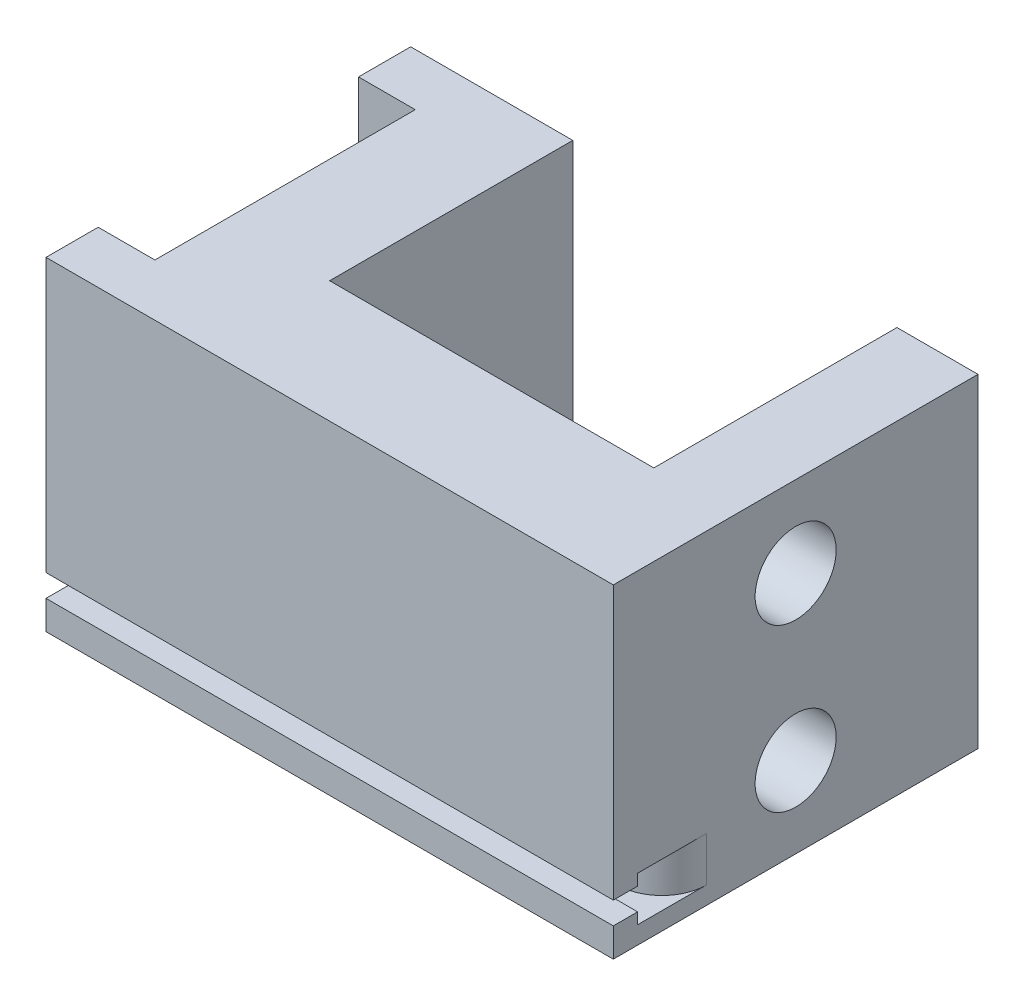
ISO-10303-21;
HEADER;
FILE_DESCRIPTION(('STEP AP214'),'2;1');
FILE_NAME('part.step','',(''),(''),'','','');
FILE_SCHEMA(('AUTOMOTIVE_DESIGN { 1 0 10303 214 1 1 1 1 }'));
ENDSEC;
DATA;
#1=APPLICATION_CONTEXT('core data for automotive mechanical design processes');
#2=APPLICATION_PROTOCOL_DEFINITION('international standard','automotive_design',2000,#1);
#3=PRODUCT_CONTEXT('',#1,'mechanical');
#4=PRODUCT('Part','Part','',(#3));
#5=PRODUCT_RELATED_PRODUCT_CATEGORY('part','',(#4));
#6=PRODUCT_DEFINITION_FORMATION('','',#4);
#7=PRODUCT_DEFINITION_CONTEXT('part definition',#1,'design');
#8=PRODUCT_DEFINITION('design','',#6,#7);
#9=PRODUCT_DEFINITION_SHAPE('','',#8);
#10=(LENGTH_UNIT() NAMED_UNIT(*) SI_UNIT(.MILLI.,.METRE.));
#11=(NAMED_UNIT(*) PLANE_ANGLE_UNIT() SI_UNIT($,.RADIAN.));
#12=(NAMED_UNIT(*) SI_UNIT($,.STERADIAN.) SOLID_ANGLE_UNIT());
#13=UNCERTAINTY_MEASURE_WITH_UNIT(LENGTH_MEASURE(1.E-05),#10,'distance_accuracy_value','');
#14=(GEOMETRIC_REPRESENTATION_CONTEXT(3) GLOBAL_UNCERTAINTY_ASSIGNED_CONTEXT((#13)) GLOBAL_UNIT_ASSIGNED_CONTEXT((#10,
#11,#12)) REPRESENTATION_CONTEXT('',''));
#15=CARTESIAN_POINT('',(0.,0.,0.));
#16=DIRECTION('',(0.,0.,1.));
#17=DIRECTION('',(1.,0.,0.));
#18=AXIS2_PLACEMENT_3D('',#15,#16,#17);
#19=CARTESIAN_POINT('',(0.,16.,0.));
#20=DIRECTION('',(1.,0.,0.));
#21=DIRECTION('',(0.,0.,-1.));
#22=AXIS2_PLACEMENT_3D('',#19,#20,#21);
#23=PLANE('',#22);
#24=DIRECTION('',(0.,0.,1.));
#25=VECTOR('',#24,1.);
#26=CARTESIAN_POINT('',(0.,3.95,2.575));
#27=LINE('',#26,#25);
#28=CARTESIAN_POINT('',(0.,3.95,10.1));
#29=VERTEX_POINT('',#28);
#30=CARTESIAN_POINT('',(0.,3.95,15.425));
#31=VERTEX_POINT('',#30);
#32=EDGE_CURVE('E252',#29,#31,#27,.T.);
#33=ORIENTED_EDGE('',*,*,#32,.F.);
#34=DIRECTION('',(0.,1.,0.));
#35=VECTOR('',#34,1.);
#36=CARTESIAN_POINT('',(0.,3.075,10.1));
#37=LINE('',#36,#35);
#38=CARTESIAN_POINT('',(0.,3.075,10.1));
#39=VERTEX_POINT('',#38);
#40=EDGE_CURVE('E224',#39,#29,#37,.T.);
#41=ORIENTED_EDGE('',*,*,#40,.F.);
#42=DIRECTION('',(0.,0.,-1.));
#43=VECTOR('',#42,1.);
#44=CARTESIAN_POINT('',(0.,3.075,16.8));
#45=LINE('',#44,#43);
#46=CARTESIAN_POINT('',(0.,3.075,16.8));
#47=VERTEX_POINT('',#46);
#48=EDGE_CURVE('E450',#47,#39,#45,.T.);
#49=ORIENTED_EDGE('',*,*,#48,.F.);
#50=DIRECTION('',(0.,1.,0.));
#51=VECTOR('',#50,1.);
#52=CARTESIAN_POINT('',(0.,2.525,16.8));
#53=LINE('',#52,#51);
#54=CARTESIAN_POINT('',(0.,2.525,16.8));
#55=VERTEX_POINT('',#54);
#56=EDGE_CURVE('E480',#55,#47,#53,.T.);
#57=ORIENTED_EDGE('',*,*,#56,.F.);
#58=DIRECTION('',(0.,0.,-1.));
#59=VECTOR('',#58,1.);
#60=CARTESIAN_POINT('',(0.,2.525,18.));
#61=LINE('',#60,#59);
#62=CARTESIAN_POINT('',(0.,2.525,18.));
#63=VERTEX_POINT('',#62);
#64=EDGE_CURVE('E463',#63,#55,#61,.T.);
#65=ORIENTED_EDGE('',*,*,#64,.F.);
#66=DIRECTION('',(0.,-1.,0.));
#67=VECTOR('',#66,1.);
#68=CARTESIAN_POINT('',(0.,16.,18.));
#69=LINE('',#68,#67);
#70=CARTESIAN_POINT('',(0.,16.,18.));
#71=VERTEX_POINT('',#70);
#72=EDGE_CURVE('E324',#71,#63,#69,.T.);
#73=ORIENTED_EDGE('',*,*,#72,.F.);
#74=DIRECTION('',(0.,0.,1.));
#75=VECTOR('',#74,1.);
#76=CARTESIAN_POINT('',(0.,16.,0.));
#77=LINE('',#76,#75);
#78=CARTESIAN_POINT('',(0.,16.,15.425));
#79=VERTEX_POINT('',#78);
#80=EDGE_CURVE('E270',#79,#71,#77,.T.);
#81=ORIENTED_EDGE('',*,*,#80,.F.);
#82=DIRECTION('',(0.,1.,0.));
#83=VECTOR('',#82,1.);
#84=CARTESIAN_POINT('',(0.,16.,15.425));
#85=LINE('',#84,#83);
#86=EDGE_CURVE('E255',#31,#79,#85,.T.);
#87=ORIENTED_EDGE('',*,*,#86,.F.);
#88=EDGE_LOOP('',(#33,#41,#49,#57,#65,#73,#81,#87));
#89=FACE_BOUND('',#88,.T.);
#90=ADVANCED_FACE('F40',(#89),#23,.F.);
#91=CARTESIAN_POINT('',(2.8,3.95,2.575));
#92=DIRECTION('',(0.,-1.,0.));
#93=DIRECTION('',(0.,0.,-1.));
#94=AXIS2_PLACEMENT_3D('',#91,#92,#93);
#95=PLANE('',#94);
#96=DIRECTION('',(0.,0.,1.));
#97=VECTOR('',#96,1.);
#98=CARTESIAN_POINT('',(2.8,3.95,2.575));
#99=LINE('',#98,#97);
#100=CARTESIAN_POINT('',(2.8,3.95,10.1));
#101=VERTEX_POINT('',#100);
#102=CARTESIAN_POINT('',(2.8,3.95,15.425));
#103=VERTEX_POINT('',#102);
#104=EDGE_CURVE('E240',#101,#103,#99,.T.);
#105=ORIENTED_EDGE('',*,*,#104,.F.);
#106=DIRECTION('',(-1.,0.,0.));
#107=VECTOR('',#106,1.);
#108=CARTESIAN_POINT('',(2.8,3.95,10.1));
#109=LINE('',#108,#107);
#110=EDGE_CURVE('E460',#101,#29,#109,.T.);
#111=ORIENTED_EDGE('',*,*,#110,.T.);
#112=ORIENTED_EDGE('',*,*,#32,.T.);
#113=DIRECTION('',(-1.,0.,0.));
#114=VECTOR('',#113,1.);
#115=CARTESIAN_POINT('',(2.8,3.95,15.425));
#116=LINE('',#115,#114);
#117=EDGE_CURVE('E263',#103,#31,#116,.T.);
#118=ORIENTED_EDGE('',*,*,#117,.F.);
#119=EDGE_LOOP('',(#105,#111,#112,#118));
#120=FACE_BOUND('',#119,.T.);
#121=ADVANCED_FACE('F415',(#120),#95,.F.);
#122=CARTESIAN_POINT('',(28.,3.075,15.6));
#123=DIRECTION('',(0.,0.,-1.));
#124=DIRECTION('',(-1.,0.,0.));
#125=AXIS2_PLACEMENT_3D('',#122,#123,#124);
#126=PLANE('',#125);
#127=DIRECTION('',(-1.,0.,0.));
#128=VECTOR('',#127,1.);
#129=CARTESIAN_POINT('',(28.,0.875,15.6));
#130=LINE('',#129,#128);
#131=CARTESIAN_POINT('',(25.8,0.875,15.6));
#132=VERTEX_POINT('',#131);
#133=CARTESIAN_POINT('',(5.,0.875,15.6));
#134=VERTEX_POINT('',#133);
#135=EDGE_CURVE('E360',#132,#134,#130,.T.);
#136=ORIENTED_EDGE('',*,*,#135,.F.);
#137=DIRECTION('',(0.,-1.,0.));
#138=VECTOR('',#137,1.);
#139=CARTESIAN_POINT('',(25.8,3.075,15.6));
#140=LINE('',#139,#138);
#141=CARTESIAN_POINT('',(25.8,3.075,15.6));
#142=VERTEX_POINT('',#141);
#143=EDGE_CURVE('E61',#132,#142,#140,.F.);
#144=ORIENTED_EDGE('',*,*,#143,.T.);
#145=DIRECTION('',(-1.,0.,0.));
#146=VECTOR('',#145,1.);
#147=CARTESIAN_POINT('',(28.,3.075,15.6));
#148=LINE('',#147,#146);
#149=CARTESIAN_POINT('',(5.,3.075,15.6));
#150=VERTEX_POINT('',#149);
#151=EDGE_CURVE('E357',#142,#150,#148,.T.);
#152=ORIENTED_EDGE('',*,*,#151,.T.);
#153=DIRECTION('',(0.,1.,0.));
#154=VECTOR('',#153,1.);
#155=CARTESIAN_POINT('',(5.,0.875,15.6));
#156=LINE('',#155,#154);
#157=EDGE_CURVE('E333',#150,#134,#156,.F.);
#158=ORIENTED_EDGE('',*,*,#157,.T.);
#159=EDGE_LOOP('',(#136,#144,#152,#158));
#160=FACE_BOUND('',#159,.T.);
#161=ADVANCED_FACE('F427',(#160),#126,.F.);
#162=CARTESIAN_POINT('',(0.,16.,18.));
#163=DIRECTION('',(0.,0.,-1.));
#164=DIRECTION('',(-1.,0.,0.));
#165=AXIS2_PLACEMENT_3D('',#162,#163,#164);
#166=PLANE('',#165);
#167=DIRECTION('',(0.,-1.,0.));
#168=VECTOR('',#167,1.);
#169=CARTESIAN_POINT('',(28.,16.,18.));
#170=LINE('',#169,#168);
#171=CARTESIAN_POINT('',(28.,1.425,18.));
#172=VERTEX_POINT('',#171);
#173=CARTESIAN_POINT('',(28.,0.,18.));
#174=VERTEX_POINT('',#173);
#175=EDGE_CURVE('E319',#172,#174,#170,.T.);
#176=ORIENTED_EDGE('',*,*,#175,.F.);
#177=DIRECTION('',(-1.,0.,0.));
#178=VECTOR('',#177,1.);
#179=CARTESIAN_POINT('',(28.,1.425,18.));
#180=LINE('',#179,#178);
#181=CARTESIAN_POINT('',(0.,1.425,18.));
#182=VERTEX_POINT('',#181);
#183=EDGE_CURVE('E386',#172,#182,#180,.T.);
#184=ORIENTED_EDGE('',*,*,#183,.T.);
#185=CARTESIAN_POINT('',(0.,0.,18.));
#186=VERTEX_POINT('',#185);
#187=EDGE_CURVE('E323',#182,#186,#69,.T.);
#188=ORIENTED_EDGE('',*,*,#187,.T.);
#189=DIRECTION('',(1.,0.,0.));
#190=VECTOR('',#189,1.);
#191=CARTESIAN_POINT('',(0.,0.,18.));
#192=LINE('',#191,#190);
#193=EDGE_CURVE('E293',#186,#174,#192,.T.);
#194=ORIENTED_EDGE('',*,*,#193,.T.);
#195=EDGE_LOOP('',(#176,#184,#188,#194));
#196=FACE_BOUND('',#195,.T.);
#197=ADVANCED_FACE('F440',(#196),#166,.F.);
#198=CARTESIAN_POINT('',(8.00000000000001,16.,0.));
#199=DIRECTION('',(0.,0.,1.));
#200=DIRECTION('',(1.,0.,0.));
#201=AXIS2_PLACEMENT_3D('',#198,#199,#200);
#202=PLANE('',#201);
#203=DIRECTION('',(-1.,0.,0.));
#204=VECTOR('',#203,1.);
#205=CARTESIAN_POINT('',(8.00000000000001,0.,0.));
#206=LINE('',#205,#204);
#207=CARTESIAN_POINT('',(8.00000000000001,0.,0.));
#208=VERTEX_POINT('',#207);
#209=CARTESIAN_POINT('',(0.,0.,0.));
#210=VERTEX_POINT('',#209);
#211=EDGE_CURVE('E259',#208,#210,#206,.T.);
#212=ORIENTED_EDGE('',*,*,#211,.T.);
#213=DIRECTION('',(0.,-1.,0.));
#214=VECTOR('',#213,1.);
#215=CARTESIAN_POINT('',(0.,16.,0.));
#216=LINE('',#215,#214);
#217=CARTESIAN_POINT('',(0.,16.,0.));
#218=VERTEX_POINT('',#217);
#219=EDGE_CURVE('E327',#218,#210,#216,.T.);
#220=ORIENTED_EDGE('',*,*,#219,.F.);
#221=DIRECTION('',(-1.,0.,0.));
#222=VECTOR('',#221,1.);
#223=CARTESIAN_POINT('',(8.00000000000001,16.,0.));
#224=LINE('',#223,#222);
#225=CARTESIAN_POINT('',(8.00000000000001,16.,0.));
#226=VERTEX_POINT('',#225);
#227=EDGE_CURVE('E267',#226,#218,#224,.T.);
#228=ORIENTED_EDGE('',*,*,#227,.F.);
#229=DIRECTION('',(0.,-1.,0.));
#230=VECTOR('',#229,1.);
#231=CARTESIAN_POINT('',(8.00000000000001,16.,0.));
#232=LINE('',#231,#230);
#233=EDGE_CURVE('E287',#226,#208,#232,.T.);
#234=ORIENTED_EDGE('',*,*,#233,.T.);
#235=EDGE_LOOP('',(#212,#220,#228,#234));
#236=FACE_BOUND('',#235,.T.);
#237=ADVANCED_FACE('F434',(#236),#202,.F.);
#238=DIRECTION('',(0.,0.,1.));
#239=VECTOR('',#238,1.);
#240=CARTESIAN_POINT('',(0.,0.875,15.6));
#241=LINE('',#240,#239);
#242=CARTESIAN_POINT('',(0.,0.875,7.9));
#243=VERTEX_POINT('',#242);
#244=CARTESIAN_POINT('',(0.,0.875,16.8));
#245=VERTEX_POINT('',#244);
#246=EDGE_CURVE('E445',#243,#245,#241,.T.);
#247=ORIENTED_EDGE('',*,*,#246,.F.);
#248=DIRECTION('',(0.,-1.,0.));
#249=VECTOR('',#248,1.);
#250=CARTESIAN_POINT('',(0.,3.95,7.9));
#251=LINE('',#250,#249);
#252=CARTESIAN_POINT('',(0.,3.95,7.9));
#253=VERTEX_POINT('',#252);
#254=EDGE_CURVE('E446',#253,#243,#251,.T.);
#255=ORIENTED_EDGE('',*,*,#254,.F.);
#256=CARTESIAN_POINT('',(0.,3.95,2.575));
#257=VERTEX_POINT('',#256);
#258=EDGE_CURVE('E233',#257,#253,#27,.T.);
#259=ORIENTED_EDGE('',*,*,#258,.F.);
#260=DIRECTION('',(0.,-1.,0.));
#261=VECTOR('',#260,1.);
#262=CARTESIAN_POINT('',(0.,16.,2.575));
#263=LINE('',#262,#261);
#264=CARTESIAN_POINT('',(0.,16.,2.575));
#265=VERTEX_POINT('',#264);
#266=EDGE_CURVE('E249',#265,#257,#263,.T.);
#267=ORIENTED_EDGE('',*,*,#266,.F.);
#268=EDGE_CURVE('E272',#218,#265,#77,.T.);
#269=ORIENTED_EDGE('',*,*,#268,.F.);
#270=ORIENTED_EDGE('',*,*,#219,.T.);
#271=DIRECTION('',(0.,0.,1.));
#272=VECTOR('',#271,1.);
#273=CARTESIAN_POINT('',(0.,0.,0.));
#274=LINE('',#273,#272);
#275=EDGE_CURVE('E290',#210,#186,#274,.T.);
#276=ORIENTED_EDGE('',*,*,#275,.T.);
#277=ORIENTED_EDGE('',*,*,#187,.F.);
#278=DIRECTION('',(0.,0.,1.));
#279=VECTOR('',#278,1.);
#280=CARTESIAN_POINT('',(0.,1.425,16.8));
#281=LINE('',#280,#279);
#282=CARTESIAN_POINT('',(0.,1.425,16.8));
#283=VERTEX_POINT('',#282);
#284=EDGE_CURVE('E470',#283,#182,#281,.T.);
#285=ORIENTED_EDGE('',*,*,#284,.F.);
#286=DIRECTION('',(0.,1.,0.));
#287=VECTOR('',#286,1.);
#288=CARTESIAN_POINT('',(0.,0.875,16.8));
#289=LINE('',#288,#287);
#290=EDGE_CURVE('E449',#245,#283,#289,.T.);
#291=ORIENTED_EDGE('',*,*,#290,.F.);
#292=EDGE_LOOP('',(#247,#255,#259,#267,#269,#270,#276,#277,#285,#291));
#293=FACE_BOUND('',#292,.T.);
#294=ADVANCED_FACE('F422',(#293),#23,.F.);
#295=ORIENTED_EDGE('',*,*,#72,.T.);
#296=DIRECTION('',(-1.,0.,0.));
#297=VECTOR('',#296,1.);
#298=CARTESIAN_POINT('',(28.,2.525,18.));
#299=LINE('',#298,#297);
#300=CARTESIAN_POINT('',(28.,2.525,18.));
#301=VERTEX_POINT('',#300);
#302=EDGE_CURVE('E370',#301,#63,#299,.T.);
#303=ORIENTED_EDGE('',*,*,#302,.F.);
#304=CARTESIAN_POINT('',(28.,16.,18.));
#305=VERTEX_POINT('',#304);
#306=EDGE_CURVE('E320',#305,#301,#170,.T.);
#307=ORIENTED_EDGE('',*,*,#306,.F.);
#308=DIRECTION('',(1.,0.,0.));
#309=VECTOR('',#308,1.);
#310=CARTESIAN_POINT('',(0.,16.,18.));
#311=LINE('',#310,#309);
#312=EDGE_CURVE('E275',#71,#305,#311,.T.);
#313=ORIENTED_EDGE('',*,*,#312,.F.);
#314=EDGE_LOOP('',(#295,#303,#307,#313));
#315=FACE_BOUND('',#314,.T.);
#316=ADVANCED_FACE('F433',(#315),#166,.F.);
#317=CARTESIAN_POINT('',(28.,16.,18.));
#318=DIRECTION('',(-1.,0.,0.));
#319=DIRECTION('',(0.,0.,1.));
#320=AXIS2_PLACEMENT_3D('',#317,#318,#319);
#321=PLANE('',#320);
#322=CARTESIAN_POINT('',(28.,12.,9.));
#323=DIRECTION('',(1.,0.,0.));
#324=DIRECTION('',(0.,0.,-1.));
#325=AXIS2_PLACEMENT_3D('',#322,#323,#324);
#326=CIRCLE('',#325,2.);
#327=CARTESIAN_POINT('',(28.,12.,7.));
#328=VERTEX_POINT('',#327);
#329=EDGE_CURVE('E377',#328,#328,#326,.T.);
#330=ORIENTED_EDGE('',*,*,#329,.F.);
#331=EDGE_LOOP('',(#330));
#332=FACE_BOUND('',#331,.T.);
#333=CARTESIAN_POINT('',(28.,4.,9.));
#334=DIRECTION('',(1.,0.,0.));
#335=DIRECTION('',(0.,0.,-1.));
#336=AXIS2_PLACEMENT_3D('',#333,#334,#335);
#337=CIRCLE('',#336,2.);
#338=CARTESIAN_POINT('',(28.,4.,7.));
#339=VERTEX_POINT('',#338);
#340=EDGE_CURVE('E380',#339,#339,#337,.T.);
#341=ORIENTED_EDGE('',*,*,#340,.F.);
#342=EDGE_LOOP('',(#341));
#343=FACE_BOUND('',#342,.T.);
#344=DIRECTION('',(0.,-1.,0.));
#345=VECTOR('',#344,1.);
#346=CARTESIAN_POINT('',(28.,16.,13.4));
#347=LINE('',#346,#345);
#348=CARTESIAN_POINT('',(28.,3.075,13.4));
#349=VERTEX_POINT('',#348);
#350=CARTESIAN_POINT('',(28.,0.875,13.4));
#351=VERTEX_POINT('',#350);
#352=EDGE_CURVE('E341',#349,#351,#347,.T.);
#353=ORIENTED_EDGE('',*,*,#352,.T.);
#354=DIRECTION('',(0.,0.,1.));
#355=VECTOR('',#354,1.);
#356=CARTESIAN_POINT('',(28.,0.875,15.6));
#357=LINE('',#356,#355);
#358=CARTESIAN_POINT('',(28.,0.875,16.8));
#359=VERTEX_POINT('',#358);
#360=EDGE_CURVE('E349',#351,#359,#357,.T.);
#361=ORIENTED_EDGE('',*,*,#360,.T.);
#362=DIRECTION('',(0.,1.,0.));
#363=VECTOR('',#362,1.);
#364=CARTESIAN_POINT('',(28.,0.875,16.8));
#365=LINE('',#364,#363);
#366=CARTESIAN_POINT('',(28.,1.425,16.8));
#367=VERTEX_POINT('',#366);
#368=EDGE_CURVE('E474',#359,#367,#365,.T.);
#369=ORIENTED_EDGE('',*,*,#368,.T.);
#370=DIRECTION('',(0.,0.,1.));
#371=VECTOR('',#370,1.);
#372=CARTESIAN_POINT('',(28.,1.425,16.8));
#373=LINE('',#372,#371);
#374=EDGE_CURVE('E372',#367,#172,#373,.T.);
#375=ORIENTED_EDGE('',*,*,#374,.T.);
#376=ORIENTED_EDGE('',*,*,#175,.T.);
#377=DIRECTION('',(0.,0.,-1.));
#378=VECTOR('',#377,1.);
#379=CARTESIAN_POINT('',(28.,0.,18.));
#380=LINE('',#379,#378);
#381=CARTESIAN_POINT('',(28.,0.,0.));
#382=VERTEX_POINT('',#381);
#383=EDGE_CURVE('E296',#174,#382,#380,.T.);
#384=ORIENTED_EDGE('',*,*,#383,.T.);
#385=DIRECTION('',(0.,-1.,0.));
#386=VECTOR('',#385,1.);
#387=CARTESIAN_POINT('',(28.,16.,0.));
#388=LINE('',#387,#386);
#389=CARTESIAN_POINT('',(28.,16.,0.));
#390=VERTEX_POINT('',#389);
#391=EDGE_CURVE('E316',#390,#382,#388,.T.);
#392=ORIENTED_EDGE('',*,*,#391,.F.);
#393=DIRECTION('',(0.,0.,-1.));
#394=VECTOR('',#393,1.);
#395=CARTESIAN_POINT('',(28.,16.,18.));
#396=LINE('',#395,#394);
#397=EDGE_CURVE('E277',#305,#390,#396,.T.);
#398=ORIENTED_EDGE('',*,*,#397,.F.);
#399=ORIENTED_EDGE('',*,*,#306,.T.);
#400=DIRECTION('',(0.,0.,-1.));
#401=VECTOR('',#400,1.);
#402=CARTESIAN_POINT('',(28.,2.525,18.));
#403=LINE('',#402,#401);
#404=CARTESIAN_POINT('',(28.,2.525,16.8));
#405=VERTEX_POINT('',#404);
#406=EDGE_CURVE('E466',#301,#405,#403,.T.);
#407=ORIENTED_EDGE('',*,*,#406,.T.);
#408=DIRECTION('',(0.,1.,0.));
#409=VECTOR('',#408,1.);
#410=CARTESIAN_POINT('',(28.,2.525,16.8));
#411=LINE('',#410,#409);
#412=CARTESIAN_POINT('',(28.,3.075,16.8));
#413=VERTEX_POINT('',#412);
#414=EDGE_CURVE('E469',#405,#413,#411,.T.);
#415=ORIENTED_EDGE('',*,*,#414,.T.);
#416=DIRECTION('',(0.,0.,-1.));
#417=VECTOR('',#416,1.);
#418=CARTESIAN_POINT('',(28.,3.075,16.8));
#419=LINE('',#418,#417);
#420=EDGE_CURVE('E352',#413,#349,#419,.T.);
#421=ORIENTED_EDGE('',*,*,#420,.T.);
#422=EDGE_LOOP('',(#353,#361,#369,#375,#376,#384,#392,#398,#399,#407,#415,#421));
#423=FACE_BOUND('',#422,.T.);
#424=ADVANCED_FACE('F347',(#332,#343,#423),#321,.F.);
#425=CARTESIAN_POINT('',(28.,16.,0.));
#426=DIRECTION('',(0.,0.,1.));
#427=DIRECTION('',(1.,0.,0.));
#428=AXIS2_PLACEMENT_3D('',#425,#426,#427);
#429=PLANE('',#428);
#430=DIRECTION('',(-1.,0.,0.));
#431=VECTOR('',#430,1.);
#432=CARTESIAN_POINT('',(28.,0.,0.));
#433=LINE('',#432,#431);
#434=CARTESIAN_POINT('',(24.,0.,0.));
#435=VERTEX_POINT('',#434);
#436=EDGE_CURVE('E298',#382,#435,#433,.T.);
#437=ORIENTED_EDGE('',*,*,#436,.T.);
#438=DIRECTION('',(0.,-1.,0.));
#439=VECTOR('',#438,1.);
#440=CARTESIAN_POINT('',(24.,16.,0.));
#441=LINE('',#440,#439);
#442=CARTESIAN_POINT('',(24.,16.,0.));
#443=VERTEX_POINT('',#442);
#444=EDGE_CURVE('E313',#443,#435,#441,.T.);
#445=ORIENTED_EDGE('',*,*,#444,.F.);
#446=DIRECTION('',(-1.,0.,0.));
#447=VECTOR('',#446,1.);
#448=CARTESIAN_POINT('',(28.,16.,0.));
#449=LINE('',#448,#447);
#450=EDGE_CURVE('E279',#390,#443,#449,.T.);
#451=ORIENTED_EDGE('',*,*,#450,.F.);
#452=ORIENTED_EDGE('',*,*,#391,.T.);
#453=EDGE_LOOP('',(#437,#445,#451,#452));
#454=FACE_BOUND('',#453,.T.);
#455=ADVANCED_FACE('F508',(#454),#429,.F.);
#456=CARTESIAN_POINT('',(24.,16.,0.));
#457=DIRECTION('',(1.,0.,0.));
#458=DIRECTION('',(0.,0.,-1.));
#459=AXIS2_PLACEMENT_3D('',#456,#457,#458);
#460=PLANE('',#459);
#461=CARTESIAN_POINT('',(24.,12.,9.));
#462=DIRECTION('',(1.,0.,0.));
#463=DIRECTION('',(0.,0.,-1.));
#464=AXIS2_PLACEMENT_3D('',#461,#462,#463);
#465=CIRCLE('',#464,2.);
#466=CARTESIAN_POINT('',(24.,12.,7.));
#467=VERTEX_POINT('',#466);
#468=EDGE_CURVE('E373',#467,#467,#465,.F.);
#469=ORIENTED_EDGE('',*,*,#468,.F.);
#470=EDGE_LOOP('',(#469));
#471=FACE_BOUND('',#470,.T.);
#472=CARTESIAN_POINT('',(24.,4.,9.));
#473=DIRECTION('',(1.,0.,0.));
#474=DIRECTION('',(0.,0.,-1.));
#475=AXIS2_PLACEMENT_3D('',#472,#473,#474);
#476=CIRCLE('',#475,2.);
#477=CARTESIAN_POINT('',(24.,4.,7.));
#478=VERTEX_POINT('',#477);
#479=EDGE_CURVE('E383',#478,#478,#476,.F.);
#480=ORIENTED_EDGE('',*,*,#479,.F.);
#481=EDGE_LOOP('',(#480));
#482=FACE_BOUND('',#481,.T.);
#483=DIRECTION('',(0.,0.,1.));
#484=VECTOR('',#483,1.);
#485=CARTESIAN_POINT('',(24.,0.,0.));
#486=LINE('',#485,#484);
#487=CARTESIAN_POINT('',(24.,0.,12.));
#488=VERTEX_POINT('',#487);
#489=EDGE_CURVE('E300',#435,#488,#486,.T.);
#490=ORIENTED_EDGE('',*,*,#489,.T.);
#491=DIRECTION('',(0.,-1.,0.));
#492=VECTOR('',#491,1.);
#493=CARTESIAN_POINT('',(24.,16.,12.));
#494=LINE('',#493,#492);
#495=CARTESIAN_POINT('',(24.,16.,12.));
#496=VERTEX_POINT('',#495);
#497=EDGE_CURVE('E310',#496,#488,#494,.T.);
#498=ORIENTED_EDGE('',*,*,#497,.F.);
#499=DIRECTION('',(0.,0.,1.));
#500=VECTOR('',#499,1.);
#501=CARTESIAN_POINT('',(24.,16.,0.));
#502=LINE('',#501,#500);
#503=EDGE_CURVE('E281',#443,#496,#502,.T.);
#504=ORIENTED_EDGE('',*,*,#503,.F.);
#505=ORIENTED_EDGE('',*,*,#444,.T.);
#506=EDGE_LOOP('',(#490,#498,#504,#505));
#507=FACE_BOUND('',#506,.T.);
#508=ADVANCED_FACE('F598',(#471,#482,#507),#460,.F.);
#509=CARTESIAN_POINT('',(24.,16.,12.));
#510=DIRECTION('',(0.,0.,1.));
#511=DIRECTION('',(1.,0.,0.));
#512=AXIS2_PLACEMENT_3D('',#509,#510,#511);
#513=PLANE('',#512);
#514=DIRECTION('',(-1.,0.,0.));
#515=VECTOR('',#514,1.);
#516=CARTESIAN_POINT('',(24.,0.,12.));
#517=LINE('',#516,#515);
#518=CARTESIAN_POINT('',(8.,0.,12.));
#519=VERTEX_POINT('',#518);
#520=EDGE_CURVE('E302',#488,#519,#517,.T.);
#521=ORIENTED_EDGE('',*,*,#520,.T.);
#522=DIRECTION('',(0.,-1.,0.));
#523=VECTOR('',#522,1.);
#524=CARTESIAN_POINT('',(8.,16.,12.));
#525=LINE('',#524,#523);
#526=CARTESIAN_POINT('',(8.,16.,12.));
#527=VERTEX_POINT('',#526);
#528=EDGE_CURVE('E307',#527,#519,#525,.T.);
#529=ORIENTED_EDGE('',*,*,#528,.F.);
#530=DIRECTION('',(-1.,0.,0.));
#531=VECTOR('',#530,1.);
#532=CARTESIAN_POINT('',(24.,16.,12.));
#533=LINE('',#532,#531);
#534=EDGE_CURVE('E283',#496,#527,#533,.T.);
#535=ORIENTED_EDGE('',*,*,#534,.F.);
#536=ORIENTED_EDGE('',*,*,#497,.T.);
#537=EDGE_LOOP('',(#521,#529,#535,#536));
#538=FACE_BOUND('',#537,.T.);
#539=ADVANCED_FACE('F601',(#538),#513,.F.);
#540=CARTESIAN_POINT('',(8.,16.,12.));
#541=DIRECTION('',(-1.,0.,0.));
#542=DIRECTION('',(0.,0.,1.));
#543=AXIS2_PLACEMENT_3D('',#540,#541,#542);
#544=PLANE('',#543);
#545=DIRECTION('',(0.,0.,-1.));
#546=VECTOR('',#545,1.);
#547=CARTESIAN_POINT('',(8.,0.,12.));
#548=LINE('',#547,#546);
#549=EDGE_CURVE('E271',#519,#208,#548,.T.);
#550=ORIENTED_EDGE('',*,*,#549,.T.);
#551=ORIENTED_EDGE('',*,*,#233,.F.);
#552=DIRECTION('',(0.,0.,-1.));
#553=VECTOR('',#552,1.);
#554=CARTESIAN_POINT('',(8.,16.,12.));
#555=LINE('',#554,#553);
#556=EDGE_CURVE('E285',#527,#226,#555,.T.);
#557=ORIENTED_EDGE('',*,*,#556,.F.);
#558=ORIENTED_EDGE('',*,*,#528,.T.);
#559=EDGE_LOOP('',(#550,#551,#557,#558));
#560=FACE_BOUND('',#559,.T.);
#561=ADVANCED_FACE('F753',(#560),#544,.F.);
#562=CARTESIAN_POINT('',(0.,16.,0.));
#563=DIRECTION('',(0.,1.,0.));
#564=DIRECTION('',(0.,0.,1.));
#565=AXIS2_PLACEMENT_3D('',#562,#563,#564);
#566=PLANE('',#565);
#567=DIRECTION('',(-1.,0.,0.));
#568=VECTOR('',#567,1.);
#569=CARTESIAN_POINT('',(2.8,16.,2.575));
#570=LINE('',#569,#568);
#571=CARTESIAN_POINT('',(2.8,16.,2.575));
#572=VERTEX_POINT('',#571);
#573=EDGE_CURVE('E257',#572,#265,#570,.T.);
#574=ORIENTED_EDGE('',*,*,#573,.F.);
#575=DIRECTION('',(0.,0.,-1.));
#576=VECTOR('',#575,1.);
#577=CARTESIAN_POINT('',(2.8,16.,2.575));
#578=LINE('',#577,#576);
#579=CARTESIAN_POINT('',(2.8,16.,15.425));
#580=VERTEX_POINT('',#579);
#581=EDGE_CURVE('E242',#580,#572,#578,.T.);
#582=ORIENTED_EDGE('',*,*,#581,.F.);
#583=DIRECTION('',(-1.,0.,0.));
#584=VECTOR('',#583,1.);
#585=CARTESIAN_POINT('',(2.8,16.,15.425));
#586=LINE('',#585,#584);
#587=EDGE_CURVE('E260',#580,#79,#586,.T.);
#588=ORIENTED_EDGE('',*,*,#587,.T.);
#589=ORIENTED_EDGE('',*,*,#80,.T.);
#590=ORIENTED_EDGE('',*,*,#312,.T.);
#591=ORIENTED_EDGE('',*,*,#397,.T.);
#592=ORIENTED_EDGE('',*,*,#450,.T.);
#593=ORIENTED_EDGE('',*,*,#503,.T.);
#594=ORIENTED_EDGE('',*,*,#534,.T.);
#595=ORIENTED_EDGE('',*,*,#556,.T.);
#596=ORIENTED_EDGE('',*,*,#227,.T.);
#597=ORIENTED_EDGE('',*,*,#268,.T.);
#598=EDGE_LOOP('',(#574,#582,#588,#589,#590,#591,#592,#593,#594,#595,#596,#597));
#599=FACE_BOUND('',#598,.T.);
#600=ADVANCED_FACE('F513',(#599),#566,.T.);
#601=CARTESIAN_POINT('',(0.,0.,0.));
#602=DIRECTION('',(0.,1.,0.));
#603=DIRECTION('',(0.,0.,1.));
#604=AXIS2_PLACEMENT_3D('',#601,#602,#603);
#605=PLANE('',#604);
#606=ORIENTED_EDGE('',*,*,#211,.F.);
#607=ORIENTED_EDGE('',*,*,#549,.F.);
#608=ORIENTED_EDGE('',*,*,#520,.F.);
#609=ORIENTED_EDGE('',*,*,#489,.F.);
#610=ORIENTED_EDGE('',*,*,#436,.F.);
#611=ORIENTED_EDGE('',*,*,#383,.F.);
#612=ORIENTED_EDGE('',*,*,#193,.F.);
#613=ORIENTED_EDGE('',*,*,#275,.F.);
#614=EDGE_LOOP('',(#606,#607,#608,#609,#610,#611,#612,#613));
#615=FACE_BOUND('',#614,.T.);
#616=ADVANCED_FACE('F502',(#615),#605,.F.);
#617=CARTESIAN_POINT('',(2.8,16.,2.575));
#618=DIRECTION('',(0.,0.,-1.));
#619=DIRECTION('',(-1.,0.,0.));
#620=AXIS2_PLACEMENT_3D('',#617,#618,#619);
#621=PLANE('',#620);
#622=ORIENTED_EDGE('',*,*,#266,.T.);
#623=DIRECTION('',(-1.,0.,0.));
#624=VECTOR('',#623,1.);
#625=CARTESIAN_POINT('',(2.8,3.95,2.575));
#626=LINE('',#625,#624);
#627=CARTESIAN_POINT('',(2.8,3.95,2.575));
#628=VERTEX_POINT('',#627);
#629=EDGE_CURVE('E248',#628,#257,#626,.T.);
#630=ORIENTED_EDGE('',*,*,#629,.F.);
#631=DIRECTION('',(0.,-1.,0.));
#632=VECTOR('',#631,1.);
#633=CARTESIAN_POINT('',(2.8,16.,2.575));
#634=LINE('',#633,#632);
#635=EDGE_CURVE('E238',#572,#628,#634,.T.);
#636=ORIENTED_EDGE('',*,*,#635,.F.);
#637=ORIENTED_EDGE('',*,*,#573,.T.);
#638=EDGE_LOOP('',(#622,#630,#636,#637));
#639=FACE_BOUND('',#638,.T.);
#640=ADVANCED_FACE('F727',(#639),#621,.F.);
#641=CARTESIAN_POINT('',(2.8,16.,15.425));
#642=DIRECTION('',(0.,0.,1.));
#643=DIRECTION('',(0.,-1.,0.));
#644=AXIS2_PLACEMENT_3D('',#641,#642,#643);
#645=PLANE('',#644);
#646=ORIENTED_EDGE('',*,*,#86,.T.);
#647=ORIENTED_EDGE('',*,*,#587,.F.);
#648=DIRECTION('',(0.,1.,0.));
#649=VECTOR('',#648,1.);
#650=CARTESIAN_POINT('',(2.8,16.,15.425));
#651=LINE('',#650,#649);
#652=EDGE_CURVE('E239',#103,#580,#651,.T.);
#653=ORIENTED_EDGE('',*,*,#652,.F.);
#654=ORIENTED_EDGE('',*,*,#117,.T.);
#655=EDGE_LOOP('',(#646,#647,#653,#654));
#656=FACE_BOUND('',#655,.T.);
#657=ADVANCED_FACE('F413',(#656),#645,.F.);
#658=ORIENTED_EDGE('',*,*,#258,.T.);
#659=DIRECTION('',(-1.,0.,0.));
#660=VECTOR('',#659,1.);
#661=CARTESIAN_POINT('',(2.8,3.95,7.9));
#662=LINE('',#661,#660);
#663=CARTESIAN_POINT('',(2.8,3.95,7.9));
#664=VERTEX_POINT('',#663);
#665=EDGE_CURVE('E215',#664,#253,#662,.T.);
#666=ORIENTED_EDGE('',*,*,#665,.F.);
#667=EDGE_CURVE('E230',#628,#664,#99,.T.);
#668=ORIENTED_EDGE('',*,*,#667,.F.);
#669=ORIENTED_EDGE('',*,*,#629,.T.);
#670=EDGE_LOOP('',(#658,#666,#668,#669));
#671=FACE_BOUND('',#670,.T.);
#672=ADVANCED_FACE('F229',(#671),#95,.F.);
#673=CARTESIAN_POINT('',(2.8,0.,0.));
#674=DIRECTION('',(-1.,0.,0.));
#675=DIRECTION('',(0.,0.,1.));
#676=AXIS2_PLACEMENT_3D('',#673,#674,#675);
#677=PLANE('',#676);
#678=CARTESIAN_POINT('',(2.8,10.95,5.825));
#679=DIRECTION('',(-1.,0.,0.));
#680=DIRECTION('',(0.,0.,1.));
#681=AXIS2_PLACEMENT_3D('',#678,#679,#680);
#682=CIRCLE('',#681,1.5);
#683=CARTESIAN_POINT('',(2.8,10.95,7.325));
#684=VERTEX_POINT('',#683);
#685=EDGE_CURVE('E389',#684,#684,#682,.T.);
#686=ORIENTED_EDGE('',*,*,#685,.F.);
#687=EDGE_LOOP('',(#686));
#688=FACE_BOUND('',#687,.T.);
#689=CARTESIAN_POINT('',(2.8,10.95,12.175));
#690=DIRECTION('',(-1.,0.,0.));
#691=DIRECTION('',(0.,0.,1.));
#692=AXIS2_PLACEMENT_3D('',#689,#690,#691);
#693=CIRCLE('',#692,1.5);
#694=CARTESIAN_POINT('',(2.8,10.95,13.675));
#695=VERTEX_POINT('',#694);
#696=EDGE_CURVE('E392',#695,#695,#693,.T.);
#697=ORIENTED_EDGE('',*,*,#696,.F.);
#698=EDGE_LOOP('',(#697));
#699=FACE_BOUND('',#698,.T.);
#700=DIRECTION('',(0.,0.,1.));
#701=VECTOR('',#700,1.);
#702=CARTESIAN_POINT('',(2.8,0.875,7.9));
#703=LINE('',#702,#701);
#704=CARTESIAN_POINT('',(2.8,0.875,7.9));
#705=VERTEX_POINT('',#704);
#706=CARTESIAN_POINT('',(2.8,0.875,13.4));
#707=VERTEX_POINT('',#706);
#708=EDGE_CURVE('E223',#705,#707,#703,.T.);
#709=ORIENTED_EDGE('',*,*,#708,.T.);
#710=DIRECTION('',(0.,1.,0.));
#711=VECTOR('',#710,1.);
#712=CARTESIAN_POINT('',(2.8,3.075,13.4));
#713=LINE('',#712,#711);
#714=CARTESIAN_POINT('',(2.8,3.075,13.4));
#715=VERTEX_POINT('',#714);
#716=EDGE_CURVE('E330',#707,#715,#713,.T.);
#717=ORIENTED_EDGE('',*,*,#716,.T.);
#718=DIRECTION('',(0.,0.,-1.));
#719=VECTOR('',#718,1.);
#720=CARTESIAN_POINT('',(2.8,3.075,15.6));
#721=LINE('',#720,#719);
#722=CARTESIAN_POINT('',(2.8,3.075,10.1));
#723=VERTEX_POINT('',#722);
#724=EDGE_CURVE('E541',#715,#723,#721,.T.);
#725=ORIENTED_EDGE('',*,*,#724,.T.);
#726=DIRECTION('',(0.,1.,0.));
#727=VECTOR('',#726,1.);
#728=CARTESIAN_POINT('',(2.8,3.075,10.1));
#729=LINE('',#728,#727);
#730=EDGE_CURVE('E234',#723,#101,#729,.T.);
#731=ORIENTED_EDGE('',*,*,#730,.T.);
#732=ORIENTED_EDGE('',*,*,#104,.T.);
#733=ORIENTED_EDGE('',*,*,#652,.T.);
#734=ORIENTED_EDGE('',*,*,#581,.T.);
#735=ORIENTED_EDGE('',*,*,#635,.T.);
#736=ORIENTED_EDGE('',*,*,#667,.T.);
#737=DIRECTION('',(0.,-1.,0.));
#738=VECTOR('',#737,1.);
#739=CARTESIAN_POINT('',(2.8,3.95,7.9));
#740=LINE('',#739,#738);
#741=EDGE_CURVE('E211',#664,#705,#740,.T.);
#742=ORIENTED_EDGE('',*,*,#741,.T.);
#743=EDGE_LOOP('',(#709,#717,#725,#731,#732,#733,#734,#735,#736,#742));
#744=FACE_BOUND('',#743,.T.);
#745=ADVANCED_FACE('F236',(#688,#699,#744),#677,.T.);
#746=CARTESIAN_POINT('',(5.8,10.95,12.175));
#747=DIRECTION('',(-1.,0.,0.));
#748=DIRECTION('',(0.,0.,1.));
#749=AXIS2_PLACEMENT_3D('',#746,#747,#748);
#750=CYLINDRICAL_SURFACE('',#749,1.5);
#751=CARTESIAN_POINT('',(5.8,10.95,12.175));
#752=DIRECTION('',(-1.,0.,0.));
#753=DIRECTION('',(0.,0.,1.));
#754=AXIS2_PLACEMENT_3D('',#751,#752,#753);
#755=CIRCLE('',#754,1.5);
#756=CARTESIAN_POINT('',(5.8,10.95,13.675));
#757=VERTEX_POINT('',#756);
#758=EDGE_CURVE('E376',#757,#757,#755,.T.);
#759=ORIENTED_EDGE('',*,*,#758,.F.);
#760=EDGE_LOOP('',(#759));
#761=FACE_BOUND('',#760,.T.);
#762=ORIENTED_EDGE('',*,*,#696,.T.);
#763=EDGE_LOOP('',(#762));
#764=FACE_BOUND('',#763,.T.);
#765=ADVANCED_FACE('F399',(#761,#764),#750,.F.);
#766=CARTESIAN_POINT('',(5.8,10.95,12.175));
#767=DIRECTION('',(-1.,0.,0.));
#768=DIRECTION('',(0.,0.,1.));
#769=AXIS2_PLACEMENT_3D('',#766,#767,#768);
#770=PLANE('',#769);
#771=ORIENTED_EDGE('',*,*,#758,.T.);
#772=EDGE_LOOP('',(#771));
#773=FACE_BOUND('',#772,.T.);
#774=ADVANCED_FACE('F397',(#773),#770,.T.);
#775=CARTESIAN_POINT('',(5.8,10.95,5.825));
#776=DIRECTION('',(-1.,0.,0.));
#777=DIRECTION('',(0.,0.,1.));
#778=AXIS2_PLACEMENT_3D('',#775,#776,#777);
#779=CYLINDRICAL_SURFACE('',#778,1.5);
#780=CARTESIAN_POINT('',(5.8,10.95,5.825));
#781=DIRECTION('',(-1.,0.,0.));
#782=DIRECTION('',(0.,0.,1.));
#783=AXIS2_PLACEMENT_3D('',#780,#781,#782);
#784=CIRCLE('',#783,1.5);
#785=CARTESIAN_POINT('',(5.8,10.95,7.325));
#786=VERTEX_POINT('',#785);
#787=EDGE_CURVE('E253',#786,#786,#784,.T.);
#788=ORIENTED_EDGE('',*,*,#787,.F.);
#789=EDGE_LOOP('',(#788));
#790=FACE_BOUND('',#789,.T.);
#791=ORIENTED_EDGE('',*,*,#685,.T.);
#792=EDGE_LOOP('',(#791));
#793=FACE_BOUND('',#792,.T.);
#794=ADVANCED_FACE('F573',(#790,#793),#779,.F.);
#795=CARTESIAN_POINT('',(5.8,10.95,5.825));
#796=DIRECTION('',(-1.,0.,0.));
#797=DIRECTION('',(0.,0.,1.));
#798=AXIS2_PLACEMENT_3D('',#795,#796,#797);
#799=PLANE('',#798);
#800=ORIENTED_EDGE('',*,*,#787,.T.);
#801=EDGE_LOOP('',(#800));
#802=FACE_BOUND('',#801,.T.);
#803=ADVANCED_FACE('F569',(#802),#799,.T.);
#804=CARTESIAN_POINT('',(-0.001000000000001,4.,9.));
#805=DIRECTION('',(1.,0.,0.));
#806=DIRECTION('',(0.,0.,-1.));
#807=AXIS2_PLACEMENT_3D('',#804,#805,#806);
#808=CYLINDRICAL_SURFACE('',#807,2.);
#809=CARTESIAN_POINT('',(28.,4.,7.));
#810=CARTESIAN_POINT('',(27.9583333333333,4.,7.));
#811=CARTESIAN_POINT('',(27.9166666666667,4.,7.));
#812=CARTESIAN_POINT('',(27.8333333333333,4.,7.));
#813=CARTESIAN_POINT('',(27.7916666666667,4.,7.));
#814=CARTESIAN_POINT('',(27.7083333333333,4.,7.));
#815=CARTESIAN_POINT('',(27.6666666666667,4.,7.));
#816=CARTESIAN_POINT('',(27.5833333333333,4.,7.));
#817=CARTESIAN_POINT('',(27.5416666666667,4.,7.));
#818=CARTESIAN_POINT('',(27.4583333333333,4.,7.));
#819=CARTESIAN_POINT('',(27.4166666666667,4.,7.));
#820=CARTESIAN_POINT('',(27.3333333333333,4.,7.));
#821=CARTESIAN_POINT('',(27.2916666666667,4.,7.));
#822=CARTESIAN_POINT('',(27.2083333333333,4.,7.));
#823=CARTESIAN_POINT('',(27.1666666666667,4.,7.));
#824=CARTESIAN_POINT('',(27.0833333333333,4.,7.));
#825=CARTESIAN_POINT('',(27.0416666666667,4.,7.));
#826=CARTESIAN_POINT('',(26.9583333333333,4.,7.));
#827=CARTESIAN_POINT('',(26.9166666666667,4.,7.));
#828=CARTESIAN_POINT('',(26.8333333333333,4.,7.));
#829=CARTESIAN_POINT('',(26.7916666666667,4.,7.));
#830=CARTESIAN_POINT('',(26.7083333333333,4.,7.));
#831=CARTESIAN_POINT('',(26.6666666666667,4.,7.));
#832=CARTESIAN_POINT('',(26.5833333333333,4.,7.));
#833=CARTESIAN_POINT('',(26.5416666666667,4.,7.));
#834=CARTESIAN_POINT('',(26.4583333333333,4.,7.));
#835=CARTESIAN_POINT('',(26.4166666666667,4.,7.));
#836=CARTESIAN_POINT('',(26.3333333333333,4.,7.));
#837=CARTESIAN_POINT('',(26.2916666666667,4.,7.));
#838=CARTESIAN_POINT('',(26.2083333333333,4.,7.));
#839=CARTESIAN_POINT('',(26.1666666666667,4.,7.));
#840=CARTESIAN_POINT('',(26.0833333333333,4.,7.));
#841=CARTESIAN_POINT('',(26.0416666666667,4.,7.));
#842=CARTESIAN_POINT('',(25.9583333333333,4.,7.));
#843=CARTESIAN_POINT('',(25.9166666666667,4.,7.));
#844=CARTESIAN_POINT('',(25.8333333333333,4.,7.));
#845=CARTESIAN_POINT('',(25.7916666666667,4.,7.));
#846=CARTESIAN_POINT('',(25.7083333333333,4.,7.));
#847=CARTESIAN_POINT('',(25.6666666666667,4.,7.));
#848=CARTESIAN_POINT('',(25.5833333333333,4.,7.));
#849=CARTESIAN_POINT('',(25.5416666666667,4.,7.));
#850=CARTESIAN_POINT('',(25.4583333333333,4.,7.));
#851=CARTESIAN_POINT('',(25.4166666666667,4.,7.));
#852=CARTESIAN_POINT('',(25.3333333333333,4.,7.));
#853=CARTESIAN_POINT('',(25.2916666666667,4.,7.));
#854=CARTESIAN_POINT('',(25.2083333333333,4.,7.));
#855=CARTESIAN_POINT('',(25.1666666666667,4.,7.));
#856=CARTESIAN_POINT('',(25.0833333333333,4.,7.));
#857=CARTESIAN_POINT('',(25.0416666666667,4.,7.));
#858=CARTESIAN_POINT('',(24.9583333333333,4.,7.));
#859=CARTESIAN_POINT('',(24.9166666666667,4.,7.));
#860=CARTESIAN_POINT('',(24.8333333333333,4.,7.));
#861=CARTESIAN_POINT('',(24.7916666666667,4.,7.));
#862=CARTESIAN_POINT('',(24.7083333333333,4.,7.));
#863=CARTESIAN_POINT('',(24.6666666666667,4.,7.));
#864=CARTESIAN_POINT('',(24.5833333333333,4.,7.));
#865=CARTESIAN_POINT('',(24.5416666666667,4.,7.));
#866=CARTESIAN_POINT('',(24.4583333333333,4.,7.));
#867=CARTESIAN_POINT('',(24.4166666666667,4.,7.));
#868=CARTESIAN_POINT('',(24.3333333333333,4.,7.));
#869=CARTESIAN_POINT('',(24.2916666666667,4.,7.));
#870=CARTESIAN_POINT('',(24.2083333333333,4.,7.));
#871=CARTESIAN_POINT('',(24.1666666666667,4.,7.));
#872=CARTESIAN_POINT('',(24.0833333333333,4.,7.));
#873=CARTESIAN_POINT('',(24.0416666666667,4.,7.));
#874=CARTESIAN_POINT('',(24.,4.,7.));
#875=B_SPLINE_CURVE_WITH_KNOTS('',3,(#809,#810,#811,#812,#813,#814,#815,#816,#817,#818,#819,
#820,#821,#822,#823,#824,#825,#826,#827,#828,#829,#830,#831,#832,#833,#834,#835,#836,#837,#838,
#839,#840,#841,#842,#843,#844,#845,#846,#847,#848,#849,#850,#851,#852,#853,#854,#855,#856,#857,
#858,#859,#860,#861,#862,#863,#864,#865,#866,#867,#868,#869,#870,#871,#872,#873,#874),
.UNSPECIFIED.,.F.,.F.,(4,2,2,2,2,2,2,2,2,2,2,2,2,2,2,2,2,2,2,2,2,2,2,2,2,2,2,2,2,2,2,2,4),(0.,
0.125,0.25,0.375,0.5,0.625000000000001,0.750000000000001,0.875000000000001,1.,1.125,1.25,1.375,
1.5,1.625,1.75,1.875,2.,2.125,2.25,2.375,2.5,2.625,2.75,2.875,3.,3.125,3.25,3.375,3.5,3.625,
3.75,3.875,4.),.UNSPECIFIED.);
#876=EDGE_CURVE('BSEAM565',#339,#478,#875,.T.);
#877=ORIENTED_EDGE('',*,*,#340,.T.);
#878=ORIENTED_EDGE('',*,*,#479,.T.);
#879=ORIENTED_EDGE('',*,*,#876,.T.);
#880=ORIENTED_EDGE('',*,*,#876,.F.);
#881=EDGE_LOOP('',(#877,#879,#878,#880));
#882=FACE_BOUND('',#881,.T.);
#883=ADVANCED_FACE('F565',(#882),#808,.F.);
#884=CARTESIAN_POINT('',(-0.001000000000001,12.,9.));
#885=DIRECTION('',(1.,0.,0.));
#886=DIRECTION('',(0.,0.,-1.));
#887=AXIS2_PLACEMENT_3D('',#884,#885,#886);
#888=CYLINDRICAL_SURFACE('',#887,2.);
#889=CARTESIAN_POINT('',(28.,12.,7.));
#890=CARTESIAN_POINT('',(27.9583333333333,12.,7.));
#891=CARTESIAN_POINT('',(27.9166666666667,12.,7.));
#892=CARTESIAN_POINT('',(27.8333333333333,12.,7.));
#893=CARTESIAN_POINT('',(27.7916666666667,12.,7.));
#894=CARTESIAN_POINT('',(27.7083333333333,12.,7.));
#895=CARTESIAN_POINT('',(27.6666666666667,12.,7.));
#896=CARTESIAN_POINT('',(27.5833333333333,12.,7.));
#897=CARTESIAN_POINT('',(27.5416666666667,12.,7.));
#898=CARTESIAN_POINT('',(27.4583333333333,12.,7.));
#899=CARTESIAN_POINT('',(27.4166666666667,12.,7.));
#900=CARTESIAN_POINT('',(27.3333333333333,12.,7.));
#901=CARTESIAN_POINT('',(27.2916666666667,12.,7.));
#902=CARTESIAN_POINT('',(27.2083333333333,12.,7.));
#903=CARTESIAN_POINT('',(27.1666666666667,12.,7.));
#904=CARTESIAN_POINT('',(27.0833333333333,12.,7.));
#905=CARTESIAN_POINT('',(27.0416666666667,12.,7.));
#906=CARTESIAN_POINT('',(26.9583333333333,12.,7.));
#907=CARTESIAN_POINT('',(26.9166666666667,12.,7.));
#908=CARTESIAN_POINT('',(26.8333333333333,12.,7.));
#909=CARTESIAN_POINT('',(26.7916666666667,12.,7.));
#910=CARTESIAN_POINT('',(26.7083333333333,12.,7.));
#911=CARTESIAN_POINT('',(26.6666666666667,12.,7.));
#912=CARTESIAN_POINT('',(26.5833333333333,12.,7.));
#913=CARTESIAN_POINT('',(26.5416666666667,12.,7.));
#914=CARTESIAN_POINT('',(26.4583333333333,12.,7.));
#915=CARTESIAN_POINT('',(26.4166666666667,12.,7.));
#916=CARTESIAN_POINT('',(26.3333333333333,12.,7.));
#917=CARTESIAN_POINT('',(26.2916666666667,12.,7.));
#918=CARTESIAN_POINT('',(26.2083333333333,12.,7.));
#919=CARTESIAN_POINT('',(26.1666666666667,12.,7.));
#920=CARTESIAN_POINT('',(26.0833333333333,12.,7.));
#921=CARTESIAN_POINT('',(26.0416666666667,12.,7.));
#922=CARTESIAN_POINT('',(25.9583333333333,12.,7.));
#923=CARTESIAN_POINT('',(25.9166666666667,12.,7.));
#924=CARTESIAN_POINT('',(25.8333333333333,12.,7.));
#925=CARTESIAN_POINT('',(25.7916666666667,12.,7.));
#926=CARTESIAN_POINT('',(25.7083333333333,12.,7.));
#927=CARTESIAN_POINT('',(25.6666666666667,12.,7.));
#928=CARTESIAN_POINT('',(25.5833333333333,12.,7.));
#929=CARTESIAN_POINT('',(25.5416666666667,12.,7.));
#930=CARTESIAN_POINT('',(25.4583333333333,12.,7.));
#931=CARTESIAN_POINT('',(25.4166666666667,12.,7.));
#932=CARTESIAN_POINT('',(25.3333333333333,12.,7.));
#933=CARTESIAN_POINT('',(25.2916666666667,12.,7.));
#934=CARTESIAN_POINT('',(25.2083333333333,12.,7.));
#935=CARTESIAN_POINT('',(25.1666666666667,12.,7.));
#936=CARTESIAN_POINT('',(25.0833333333333,12.,7.));
#937=CARTESIAN_POINT('',(25.0416666666667,12.,7.));
#938=CARTESIAN_POINT('',(24.9583333333333,12.,7.));
#939=CARTESIAN_POINT('',(24.9166666666667,12.,7.));
#940=CARTESIAN_POINT('',(24.8333333333333,12.,7.));
#941=CARTESIAN_POINT('',(24.7916666666667,12.,7.));
#942=CARTESIAN_POINT('',(24.7083333333333,12.,7.));
#943=CARTESIAN_POINT('',(24.6666666666667,12.,7.));
#944=CARTESIAN_POINT('',(24.5833333333333,12.,7.));
#945=CARTESIAN_POINT('',(24.5416666666667,12.,7.));
#946=CARTESIAN_POINT('',(24.4583333333333,12.,7.));
#947=CARTESIAN_POINT('',(24.4166666666667,12.,7.));
#948=CARTESIAN_POINT('',(24.3333333333333,12.,7.));
#949=CARTESIAN_POINT('',(24.2916666666667,12.,7.));
#950=CARTESIAN_POINT('',(24.2083333333333,12.,7.));
#951=CARTESIAN_POINT('',(24.1666666666667,12.,7.));
#952=CARTESIAN_POINT('',(24.0833333333333,12.,7.));
#953=CARTESIAN_POINT('',(24.0416666666667,12.,7.));
#954=CARTESIAN_POINT('',(24.,12.,7.));
#955=B_SPLINE_CURVE_WITH_KNOTS('',3,(#889,#890,#891,#892,#893,#894,#895,#896,#897,#898,#899,
#900,#901,#902,#903,#904,#905,#906,#907,#908,#909,#910,#911,#912,#913,#914,#915,#916,#917,#918,
#919,#920,#921,#922,#923,#924,#925,#926,#927,#928,#929,#930,#931,#932,#933,#934,#935,#936,#937,
#938,#939,#940,#941,#942,#943,#944,#945,#946,#947,#948,#949,#950,#951,#952,#953,#954),
.UNSPECIFIED.,.F.,.F.,(4,2,2,2,2,2,2,2,2,2,2,2,2,2,2,2,2,2,2,2,2,2,2,2,2,2,2,2,2,2,2,2,4),(0.,
0.125,0.25,0.375,0.5,0.625000000000001,0.750000000000001,0.875000000000001,1.,1.125,1.25,1.375,
1.5,1.625,1.75,1.875,2.,2.125,2.25,2.375,2.5,2.625,2.75,2.875,3.,3.125,3.25,3.375,3.5,3.625,
3.75,3.875,4.),.UNSPECIFIED.);
#956=EDGE_CURVE('BSEAM561',#328,#467,#955,.T.);
#957=ORIENTED_EDGE('',*,*,#329,.T.);
#958=ORIENTED_EDGE('',*,*,#468,.T.);
#959=ORIENTED_EDGE('',*,*,#956,.T.);
#960=ORIENTED_EDGE('',*,*,#956,.F.);
#961=EDGE_LOOP('',(#957,#959,#958,#960));
#962=FACE_BOUND('',#961,.T.);
#963=ADVANCED_FACE('F561',(#962),#888,.F.);
#964=CARTESIAN_POINT('',(28.,1.425,16.8));
#965=DIRECTION('',(0.,-1.,0.));
#966=DIRECTION('',(0.,0.,-1.));
#967=AXIS2_PLACEMENT_3D('',#964,#965,#966);
#968=PLANE('',#967);
#969=ORIENTED_EDGE('',*,*,#284,.T.);
#970=ORIENTED_EDGE('',*,*,#183,.F.);
#971=ORIENTED_EDGE('',*,*,#374,.F.);
#972=DIRECTION('',(-1.,0.,0.));
#973=VECTOR('',#972,1.);
#974=CARTESIAN_POINT('',(28.,1.425,16.8));
#975=LINE('',#974,#973);
#976=EDGE_CURVE('E488',#367,#283,#975,.T.);
#977=ORIENTED_EDGE('',*,*,#976,.T.);
#978=EDGE_LOOP('',(#969,#970,#971,#977));
#979=FACE_BOUND('',#978,.T.);
#980=ADVANCED_FACE('F564',(#979),#968,.F.);
#981=CARTESIAN_POINT('',(28.,0.875,16.8));
#982=DIRECTION('',(0.,0.,1.));
#983=DIRECTION('',(1.,0.,0.));
#984=AXIS2_PLACEMENT_3D('',#981,#982,#983);
#985=PLANE('',#984);
#986=ORIENTED_EDGE('',*,*,#290,.T.);
#987=ORIENTED_EDGE('',*,*,#976,.F.);
#988=ORIENTED_EDGE('',*,*,#368,.F.);
#989=DIRECTION('',(-1.,0.,0.));
#990=VECTOR('',#989,1.);
#991=CARTESIAN_POINT('',(28.,0.875,16.8));
#992=LINE('',#991,#990);
#993=EDGE_CURVE('E363',#359,#245,#992,.T.);
#994=ORIENTED_EDGE('',*,*,#993,.T.);
#995=EDGE_LOOP('',(#986,#987,#988,#994));
#996=FACE_BOUND('',#995,.T.);
#997=ADVANCED_FACE('F491',(#996),#985,.F.);
#998=CARTESIAN_POINT('',(28.,0.875,15.6));
#999=DIRECTION('',(0.,-1.,0.));
#1000=DIRECTION('',(0.,0.,-1.));
#1001=AXIS2_PLACEMENT_3D('',#998,#999,#1000);
#1002=PLANE('',#1001);
#1003=ORIENTED_EDGE('',*,*,#246,.T.);
#1004=ORIENTED_EDGE('',*,*,#993,.F.);
#1005=ORIENTED_EDGE('',*,*,#360,.F.);
#1006=CARTESIAN_POINT('',(25.8,0.875000000000001,13.4));
#1007=DIRECTION('',(0.,-1.,0.));
#1008=DIRECTION('',(0.,0.,-1.));
#1009=AXIS2_PLACEMENT_3D('',#1006,#1007,#1008);
#1010=CIRCLE('',#1009,2.2);
#1011=EDGE_CURVE('E48',#351,#132,#1010,.T.);
#1012=ORIENTED_EDGE('',*,*,#1011,.T.);
#1013=ORIENTED_EDGE('',*,*,#135,.T.);
#1014=CARTESIAN_POINT('',(5.,0.875,13.4));
#1015=DIRECTION('',(0.,-1.,0.));
#1016=DIRECTION('',(0.,0.,-1.));
#1017=AXIS2_PLACEMENT_3D('',#1014,#1015,#1016);
#1018=CIRCLE('',#1017,2.2);
#1019=EDGE_CURVE('E339',#134,#707,#1018,.T.);
#1020=ORIENTED_EDGE('',*,*,#1019,.T.);
#1021=ORIENTED_EDGE('',*,*,#708,.F.);
#1022=DIRECTION('',(-1.,0.,0.));
#1023=VECTOR('',#1022,1.);
#1024=CARTESIAN_POINT('',(2.8,0.875,7.9));
#1025=LINE('',#1024,#1023);
#1026=EDGE_CURVE('E218',#705,#243,#1025,.T.);
#1027=ORIENTED_EDGE('',*,*,#1026,.T.);
#1028=EDGE_LOOP('',(#1003,#1004,#1005,#1012,#1013,#1020,#1021,#1027));
#1029=FACE_BOUND('',#1028,.T.);
#1030=ADVANCED_FACE('F452',(#1029),#1002,.F.);
#1031=CARTESIAN_POINT('',(28.,3.075,16.8));
#1032=DIRECTION('',(0.,1.,0.));
#1033=DIRECTION('',(0.,0.,1.));
#1034=AXIS2_PLACEMENT_3D('',#1031,#1032,#1033);
#1035=PLANE('',#1034);
#1036=ORIENTED_EDGE('',*,*,#48,.T.);
#1037=DIRECTION('',(-1.,0.,0.));
#1038=VECTOR('',#1037,1.);
#1039=CARTESIAN_POINT('',(2.8,3.075,10.1));
#1040=LINE('',#1039,#1038);
#1041=EDGE_CURVE('E453',#723,#39,#1040,.T.);
#1042=ORIENTED_EDGE('',*,*,#1041,.F.);
#1043=ORIENTED_EDGE('',*,*,#724,.F.);
#1044=CARTESIAN_POINT('',(5.,3.075,13.4));
#1045=DIRECTION('',(0.,1.,0.));
#1046=DIRECTION('',(0.,0.,1.));
#1047=AXIS2_PLACEMENT_3D('',#1044,#1045,#1046);
#1048=CIRCLE('',#1047,2.2);
#1049=EDGE_CURVE('E336',#715,#150,#1048,.T.);
#1050=ORIENTED_EDGE('',*,*,#1049,.T.);
#1051=ORIENTED_EDGE('',*,*,#151,.F.);
#1052=CARTESIAN_POINT('',(25.8,3.075,13.4));
#1053=DIRECTION('',(0.,1.,0.));
#1054=DIRECTION('',(0.,0.,1.));
#1055=AXIS2_PLACEMENT_3D('',#1052,#1053,#1054);
#1056=CIRCLE('',#1055,2.2);
#1057=EDGE_CURVE('E11',#142,#349,#1056,.T.);
#1058=ORIENTED_EDGE('',*,*,#1057,.T.);
#1059=ORIENTED_EDGE('',*,*,#420,.F.);
#1060=DIRECTION('',(-1.,0.,0.));
#1061=VECTOR('',#1060,1.);
#1062=CARTESIAN_POINT('',(28.,3.075,16.8));
#1063=LINE('',#1062,#1061);
#1064=EDGE_CURVE('E361',#413,#47,#1063,.T.);
#1065=ORIENTED_EDGE('',*,*,#1064,.T.);
#1066=EDGE_LOOP('',(#1036,#1042,#1043,#1050,#1051,#1058,#1059,#1065));
#1067=FACE_BOUND('',#1066,.T.);
#1068=ADVANCED_FACE('F356',(#1067),#1035,.F.);
#1069=CARTESIAN_POINT('',(28.,2.525,16.8));
#1070=DIRECTION('',(0.,0.,1.));
#1071=DIRECTION('',(1.,0.,0.));
#1072=AXIS2_PLACEMENT_3D('',#1069,#1070,#1071);
#1073=PLANE('',#1072);
#1074=ORIENTED_EDGE('',*,*,#56,.T.);
#1075=ORIENTED_EDGE('',*,*,#1064,.F.);
#1076=ORIENTED_EDGE('',*,*,#414,.F.);
#1077=DIRECTION('',(-1.,0.,0.));
#1078=VECTOR('',#1077,1.);
#1079=CARTESIAN_POINT('',(28.,2.525,16.8));
#1080=LINE('',#1079,#1078);
#1081=EDGE_CURVE('E365',#405,#55,#1080,.T.);
#1082=ORIENTED_EDGE('',*,*,#1081,.T.);
#1083=EDGE_LOOP('',(#1074,#1075,#1076,#1082));
#1084=FACE_BOUND('',#1083,.T.);
#1085=ADVANCED_FACE('F528',(#1084),#1073,.F.);
#1086=CARTESIAN_POINT('',(28.,2.525,18.));
#1087=DIRECTION('',(0.,1.,0.));
#1088=DIRECTION('',(0.,0.,1.));
#1089=AXIS2_PLACEMENT_3D('',#1086,#1087,#1088);
#1090=PLANE('',#1089);
#1091=ORIENTED_EDGE('',*,*,#64,.T.);
#1092=ORIENTED_EDGE('',*,*,#1081,.F.);
#1093=ORIENTED_EDGE('',*,*,#406,.F.);
#1094=ORIENTED_EDGE('',*,*,#302,.T.);
#1095=EDGE_LOOP('',(#1091,#1092,#1093,#1094));
#1096=FACE_BOUND('',#1095,.T.);
#1097=ADVANCED_FACE('F521',(#1096),#1090,.F.);
#1098=CARTESIAN_POINT('',(2.8,3.075,10.1));
#1099=DIRECTION('',(0.,0.,1.));
#1100=DIRECTION('',(1.,0.,0.));
#1101=AXIS2_PLACEMENT_3D('',#1098,#1099,#1100);
#1102=PLANE('',#1101);
#1103=ORIENTED_EDGE('',*,*,#40,.T.);
#1104=ORIENTED_EDGE('',*,*,#110,.F.);
#1105=ORIENTED_EDGE('',*,*,#730,.F.);
#1106=ORIENTED_EDGE('',*,*,#1041,.T.);
#1107=EDGE_LOOP('',(#1103,#1104,#1105,#1106));
#1108=FACE_BOUND('',#1107,.T.);
#1109=ADVANCED_FACE('F532',(#1108),#1102,.F.);
#1110=CARTESIAN_POINT('',(2.8,3.95,7.9));
#1111=DIRECTION('',(0.,0.,-1.));
#1112=DIRECTION('',(-1.,0.,0.));
#1113=AXIS2_PLACEMENT_3D('',#1110,#1111,#1112);
#1114=PLANE('',#1113);
#1115=ORIENTED_EDGE('',*,*,#254,.T.);
#1116=ORIENTED_EDGE('',*,*,#1026,.F.);
#1117=ORIENTED_EDGE('',*,*,#741,.F.);
#1118=ORIENTED_EDGE('',*,*,#665,.T.);
#1119=EDGE_LOOP('',(#1115,#1116,#1117,#1118));
#1120=FACE_BOUND('',#1119,.T.);
#1121=ADVANCED_FACE('F214',(#1120),#1114,.F.);
#1122=CARTESIAN_POINT('',(5.,0.,13.4));
#1123=DIRECTION('',(0.,-1.,0.));
#1124=DIRECTION('',(1.,0.,0.));
#1125=AXIS2_PLACEMENT_3D('',#1122,#1123,#1124);
#1126=CYLINDRICAL_SURFACE('',#1125,2.2);
#1127=ORIENTED_EDGE('',*,*,#1019,.F.);
#1128=ORIENTED_EDGE('',*,*,#157,.F.);
#1129=ORIENTED_EDGE('',*,*,#1049,.F.);
#1130=ORIENTED_EDGE('',*,*,#716,.F.);
#1131=EDGE_LOOP('',(#1127,#1128,#1129,#1130));
#1132=FACE_BOUND('',#1131,.T.);
#1133=ADVANCED_FACE('F546',(#1132),#1126,.T.);
#1134=CARTESIAN_POINT('',(25.8,16.,13.4));
#1135=DIRECTION('',(0.,-1.,0.));
#1136=DIRECTION('',(0.,0.,-1.));
#1137=AXIS2_PLACEMENT_3D('',#1134,#1135,#1136);
#1138=CYLINDRICAL_SURFACE('',#1137,2.2);
#1139=ORIENTED_EDGE('',*,*,#1057,.F.);
#1140=ORIENTED_EDGE('',*,*,#143,.F.);
#1141=ORIENTED_EDGE('',*,*,#1011,.F.);
#1142=ORIENTED_EDGE('',*,*,#352,.F.);
#1143=EDGE_LOOP('',(#1139,#1140,#1141,#1142));
#1144=FACE_BOUND('',#1143,.T.);
#1145=ADVANCED_FACE('F42',(#1144),#1138,.T.);
#1146=CLOSED_SHELL('',(#90,#121,#161,#197,#237,#294,#316,#424,#455,#508,#539,#561,#600,#616,
#640,#657,#672,#745,#765,#774,#794,#803,#883,#963,#980,#997,#1030,#1068,#1085,#1097,#1109,#1121,
#1133,#1145));
#1147=MANIFOLD_SOLID_BREP('B2',#1146);
#1148=ADVANCED_BREP_SHAPE_REPRESENTATION('',(#18,#1147),#14);
#1149=SHAPE_DEFINITION_REPRESENTATION(#9,#1148);
ENDSEC;
END-ISO-10303-21;
